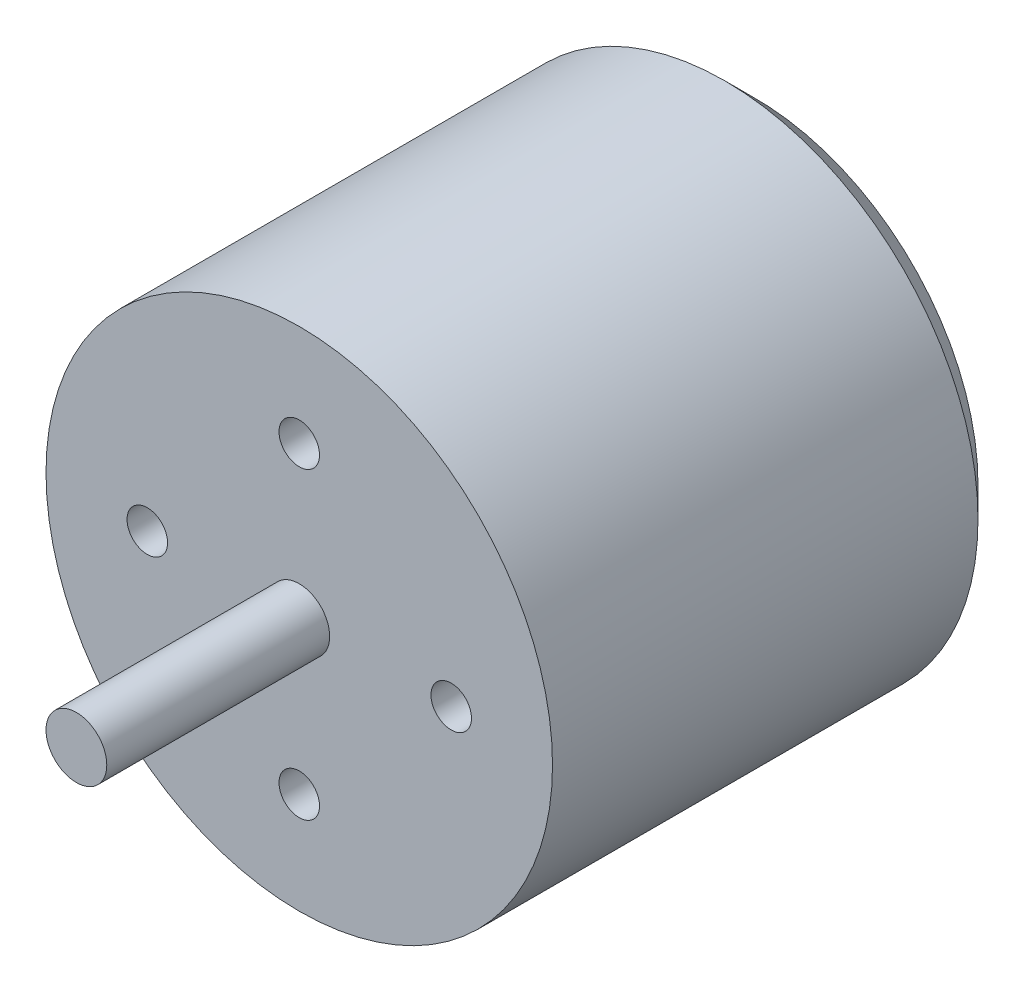
ISO-10303-21;
HEADER;
FILE_DESCRIPTION(('STEP AP214'),'2;1');
FILE_NAME('part.step','',(''),(''),'','','');
FILE_SCHEMA(('AUTOMOTIVE_DESIGN { 1 0 10303 214 1 1 1 1 }'));
ENDSEC;
DATA;
#1=APPLICATION_CONTEXT('core data for automotive mechanical design processes');
#2=APPLICATION_PROTOCOL_DEFINITION('international standard','automotive_design',2000,#1);
#3=PRODUCT_CONTEXT('',#1,'mechanical');
#4=PRODUCT('Part','Part','',(#3));
#5=PRODUCT_RELATED_PRODUCT_CATEGORY('part','',(#4));
#6=PRODUCT_DEFINITION_FORMATION('','',#4);
#7=PRODUCT_DEFINITION_CONTEXT('part definition',#1,'design');
#8=PRODUCT_DEFINITION('design','',#6,#7);
#9=PRODUCT_DEFINITION_SHAPE('','',#8);
#10=(LENGTH_UNIT() NAMED_UNIT(*) SI_UNIT(.MILLI.,.METRE.));
#11=(NAMED_UNIT(*) PLANE_ANGLE_UNIT() SI_UNIT($,.RADIAN.));
#12=(NAMED_UNIT(*) SI_UNIT($,.STERADIAN.) SOLID_ANGLE_UNIT());
#13=UNCERTAINTY_MEASURE_WITH_UNIT(LENGTH_MEASURE(1.E-05),#10,'distance_accuracy_value','');
#14=(GEOMETRIC_REPRESENTATION_CONTEXT(3) GLOBAL_UNCERTAINTY_ASSIGNED_CONTEXT((#13)) GLOBAL_UNIT_ASSIGNED_CONTEXT((#10,
#11,#12)) REPRESENTATION_CONTEXT('',''));
#15=CARTESIAN_POINT('',(0.,0.,0.));
#16=DIRECTION('',(0.,0.,1.));
#17=DIRECTION('',(1.,0.,0.));
#18=AXIS2_PLACEMENT_3D('',#15,#16,#17);
#19=CARTESIAN_POINT('',(0.,0.,45.));
#20=DIRECTION('',(0.,0.,-1.));
#21=DIRECTION('',(-1.,0.,0.));
#22=AXIS2_PLACEMENT_3D('',#19,#20,#21);
#23=CYLINDRICAL_SURFACE('',#22,25.);
#24=CARTESIAN_POINT('',(0.,0.,3.00000000000008));
#25=DIRECTION('',(0.,0.,1.));
#26=DIRECTION('',(1.,0.,0.));
#27=AXIS2_PLACEMENT_3D('',#24,#25,#26);
#28=CIRCLE('',#27,25.);
#29=CARTESIAN_POINT('',(-25.,0.,3.00000000000008));
#30=VERTEX_POINT('',#29);
#31=EDGE_CURVE('E51',#30,#30,#28,.T.);
#32=CARTESIAN_POINT('',(0.,0.,45.));
#33=DIRECTION('',(0.,0.,1.));
#34=DIRECTION('',(1.,0.,0.));
#35=AXIS2_PLACEMENT_3D('',#32,#33,#34);
#36=CIRCLE('',#35,25.);
#37=CARTESIAN_POINT('',(-25.,0.,45.));
#38=VERTEX_POINT('',#37);
#39=EDGE_CURVE('E59',#38,#38,#36,.T.);
#40=CARTESIAN_POINT('',(-25.,0.,3.00000000000008));
#41=CARTESIAN_POINT('',(-25.,0.,3.43750000000008));
#42=CARTESIAN_POINT('',(-25.,0.,3.87500000000008));
#43=CARTESIAN_POINT('',(-25.,0.,4.75000000000007));
#44=CARTESIAN_POINT('',(-25.,0.,5.18750000000007));
#45=CARTESIAN_POINT('',(-25.,0.,6.06250000000007));
#46=CARTESIAN_POINT('',(-25.,0.,6.50000000000008));
#47=CARTESIAN_POINT('',(-25.,0.,7.37500000000007));
#48=CARTESIAN_POINT('',(-25.,0.,7.81250000000007));
#49=CARTESIAN_POINT('',(-25.,0.,8.68750000000007));
#50=CARTESIAN_POINT('',(-25.,0.,9.12500000000007));
#51=CARTESIAN_POINT('',(-25.,0.,10.0000000000001));
#52=CARTESIAN_POINT('',(-25.,0.,10.4375000000001));
#53=CARTESIAN_POINT('',(-25.,0.,11.3125000000001));
#54=CARTESIAN_POINT('',(-25.,0.,11.7500000000001));
#55=CARTESIAN_POINT('',(-25.,0.,12.6250000000001));
#56=CARTESIAN_POINT('',(-25.,0.,13.0625000000001));
#57=CARTESIAN_POINT('',(-25.,0.,13.9375000000001));
#58=CARTESIAN_POINT('',(-25.,0.,14.3750000000001));
#59=CARTESIAN_POINT('',(-25.,0.,15.2500000000001));
#60=CARTESIAN_POINT('',(-25.,0.,15.6875000000001));
#61=CARTESIAN_POINT('',(-25.,0.,16.5625000000001));
#62=CARTESIAN_POINT('',(-25.,0.,17.));
#63=CARTESIAN_POINT('',(-25.,0.,17.875));
#64=CARTESIAN_POINT('',(-25.,0.,18.3125));
#65=CARTESIAN_POINT('',(-25.,0.,19.1875));
#66=CARTESIAN_POINT('',(-25.,0.,19.625));
#67=CARTESIAN_POINT('',(-25.,0.,20.5));
#68=CARTESIAN_POINT('',(-25.,0.,20.9375));
#69=CARTESIAN_POINT('',(-25.,0.,21.8125));
#70=CARTESIAN_POINT('',(-25.,0.,22.25));
#71=CARTESIAN_POINT('',(-25.,0.,23.125));
#72=CARTESIAN_POINT('',(-25.,0.,23.5625));
#73=CARTESIAN_POINT('',(-25.,0.,24.4375));
#74=CARTESIAN_POINT('',(-25.,0.,24.875));
#75=CARTESIAN_POINT('',(-25.,0.,25.75));
#76=CARTESIAN_POINT('',(-25.,0.,26.1875));
#77=CARTESIAN_POINT('',(-25.,0.,27.0625));
#78=CARTESIAN_POINT('',(-25.,0.,27.5));
#79=CARTESIAN_POINT('',(-25.,0.,28.375));
#80=CARTESIAN_POINT('',(-25.,0.,28.8125));
#81=CARTESIAN_POINT('',(-25.,0.,29.6875));
#82=CARTESIAN_POINT('',(-25.,0.,30.125));
#83=CARTESIAN_POINT('',(-25.,0.,31.));
#84=CARTESIAN_POINT('',(-25.,0.,31.4375));
#85=CARTESIAN_POINT('',(-25.,0.,32.3125));
#86=CARTESIAN_POINT('',(-25.,0.,32.75));
#87=CARTESIAN_POINT('',(-25.,0.,33.625));
#88=CARTESIAN_POINT('',(-25.,0.,34.0625));
#89=CARTESIAN_POINT('',(-25.,0.,34.9375));
#90=CARTESIAN_POINT('',(-25.,0.,35.375));
#91=CARTESIAN_POINT('',(-25.,0.,36.25));
#92=CARTESIAN_POINT('',(-25.,0.,36.6875));
#93=CARTESIAN_POINT('',(-25.,0.,37.5625));
#94=CARTESIAN_POINT('',(-25.,0.,38.));
#95=CARTESIAN_POINT('',(-25.,0.,38.875));
#96=CARTESIAN_POINT('',(-25.,0.,39.3125));
#97=CARTESIAN_POINT('',(-25.,0.,40.1875));
#98=CARTESIAN_POINT('',(-25.,0.,40.625));
#99=CARTESIAN_POINT('',(-25.,0.,41.5));
#100=CARTESIAN_POINT('',(-25.,0.,41.9375));
#101=CARTESIAN_POINT('',(-25.,0.,42.8125));
#102=CARTESIAN_POINT('',(-25.,0.,43.25));
#103=CARTESIAN_POINT('',(-25.,0.,44.125));
#104=CARTESIAN_POINT('',(-25.,0.,44.5625));
#105=CARTESIAN_POINT('',(-25.,0.,45.));
#106=B_SPLINE_CURVE_WITH_KNOTS('',3,(#40,#41,#42,#43,#44,#45,#46,#47,#48,#49,#50,#51,#52,#53,
#54,#55,#56,#57,#58,#59,#60,#61,#62,#63,#64,#65,#66,#67,#68,#69,#70,#71,#72,#73,#74,#75,#76,#77,
#78,#79,#80,#81,#82,#83,#84,#85,#86,#87,#88,#89,#90,#91,#92,#93,#94,#95,#96,#97,#98,#99,#100,
#101,#102,#103,#104,#105),.UNSPECIFIED.,.F.,.F.,(4,2,2,2,2,2,2,2,2,2,2,2,2,2,2,2,2,2,2,2,2,2,2,
2,2,2,2,2,2,2,2,2,4),(0.,1.31249999999999,2.625,3.9375,5.24999999999999,6.56249999999998,
7.87499999999999,9.18749999999999,10.5,11.8125,13.125,14.4375,15.75,17.0625,18.375,19.6875,21.,
22.3125,23.625,24.9375,26.25,27.5624999999999,28.8749999999999,30.1874999999999,
31.4999999999999,32.8124999999999,34.1249999999999,35.4374999999999,36.7499999999999,
38.0624999999999,39.3749999999999,40.6874999999999,41.9999999999999),.UNSPECIFIED.);
#107=EDGE_CURVE('BSEAM43',#30,#38,#106,.T.);
#108=ORIENTED_EDGE('',*,*,#31,.T.);
#109=ORIENTED_EDGE('',*,*,#39,.F.);
#110=ORIENTED_EDGE('',*,*,#107,.T.);
#111=ORIENTED_EDGE('',*,*,#107,.F.);
#112=EDGE_LOOP('',(#108,#110,#109,#111));
#113=FACE_BOUND('',#112,.T.);
#114=ADVANCED_FACE('F43',(#113),#23,.T.);
#115=CARTESIAN_POINT('',(0.,0.,45.));
#116=DIRECTION('',(0.,0.,1.));
#117=DIRECTION('',(1.,0.,0.));
#118=AXIS2_PLACEMENT_3D('',#115,#116,#117);
#119=PLANE('',#118);
#120=CARTESIAN_POINT('',(0.,0.,45.));
#121=DIRECTION('',(0.,0.,1.));
#122=DIRECTION('',(1.,0.,0.));
#123=AXIS2_PLACEMENT_3D('',#120,#121,#122);
#124=CIRCLE('',#123,3.);
#125=CARTESIAN_POINT('',(3.,0.,45.));
#126=VERTEX_POINT('',#125);
#127=EDGE_CURVE('E89',#126,#126,#124,.T.);
#128=ORIENTED_EDGE('',*,*,#127,.F.);
#129=EDGE_LOOP('',(#128));
#130=FACE_BOUND('',#129,.T.);
#131=CARTESIAN_POINT('',(0.,15.,45.));
#132=DIRECTION('',(0.,0.,1.));
#133=DIRECTION('',(1.,0.,0.));
#134=AXIS2_PLACEMENT_3D('',#131,#132,#133);
#135=CIRCLE('',#134,2.);
#136=CARTESIAN_POINT('',(2.,15.,45.));
#137=VERTEX_POINT('',#136);
#138=EDGE_CURVE('E84',#137,#137,#135,.T.);
#139=ORIENTED_EDGE('',*,*,#138,.F.);
#140=EDGE_LOOP('',(#139));
#141=FACE_BOUND('',#140,.T.);
#142=CARTESIAN_POINT('',(0.,-15.,45.));
#143=DIRECTION('',(0.,0.,1.));
#144=DIRECTION('',(-1.,0.,0.));
#145=AXIS2_PLACEMENT_3D('',#142,#143,#144);
#146=CIRCLE('',#145,2.);
#147=CARTESIAN_POINT('',(-2.,-15.,45.));
#148=VERTEX_POINT('',#147);
#149=EDGE_CURVE('E78',#148,#148,#146,.T.);
#150=ORIENTED_EDGE('',*,*,#149,.F.);
#151=EDGE_LOOP('',(#150));
#152=FACE_BOUND('',#151,.T.);
#153=CARTESIAN_POINT('',(-15.,0.,45.));
#154=DIRECTION('',(0.,0.,1.));
#155=DIRECTION('',(1.,0.,0.));
#156=AXIS2_PLACEMENT_3D('',#153,#154,#155);
#157=CIRCLE('',#156,2.);
#158=CARTESIAN_POINT('',(-13.,0.,45.));
#159=VERTEX_POINT('',#158);
#160=EDGE_CURVE('E72',#159,#159,#157,.T.);
#161=ORIENTED_EDGE('',*,*,#160,.F.);
#162=EDGE_LOOP('',(#161));
#163=FACE_BOUND('',#162,.T.);
#164=CARTESIAN_POINT('',(15.,0.,45.));
#165=DIRECTION('',(0.,0.,1.));
#166=DIRECTION('',(-1.,0.,0.));
#167=AXIS2_PLACEMENT_3D('',#164,#165,#166);
#168=CIRCLE('',#167,2.);
#169=CARTESIAN_POINT('',(13.,0.,45.));
#170=VERTEX_POINT('',#169);
#171=EDGE_CURVE('E65',#170,#170,#168,.T.);
#172=ORIENTED_EDGE('',*,*,#171,.F.);
#173=EDGE_LOOP('',(#172));
#174=FACE_BOUND('',#173,.T.);
#175=ORIENTED_EDGE('',*,*,#39,.T.);
#176=EDGE_LOOP('',(#175));
#177=FACE_BOUND('',#176,.T.);
#178=ADVANCED_FACE('F135',(#130,#141,#152,#163,#174,#177),#119,.T.);
#179=CARTESIAN_POINT('',(0.,0.,0.));
#180=DIRECTION('',(0.,0.,1.));
#181=DIRECTION('',(1.,0.,0.));
#182=AXIS2_PLACEMENT_3D('',#179,#180,#181);
#183=PLANE('',#182);
#184=CARTESIAN_POINT('',(0.,0.,0.));
#185=DIRECTION('',(0.,0.,1.));
#186=DIRECTION('',(1.,0.,0.));
#187=AXIS2_PLACEMENT_3D('',#184,#185,#186);
#188=CIRCLE('',#187,21.9999999999999);
#189=CARTESIAN_POINT('',(21.9999999999999,0.,0.));
#190=VERTEX_POINT('',#189);
#191=EDGE_CURVE('E10',#190,#190,#188,.F.);
#192=ORIENTED_EDGE('',*,*,#191,.T.);
#193=EDGE_LOOP('',(#192));
#194=FACE_BOUND('',#193,.T.);
#195=CARTESIAN_POINT('',(0.,0.,0.));
#196=DIRECTION('',(0.,0.,1.));
#197=DIRECTION('',(1.,0.,0.));
#198=AXIS2_PLACEMENT_3D('',#195,#196,#197);
#199=CIRCLE('',#198,3.);
#200=CARTESIAN_POINT('',(3.,0.,0.));
#201=VERTEX_POINT('',#200);
#202=EDGE_CURVE('E55',#201,#201,#199,.F.);
#203=ORIENTED_EDGE('',*,*,#202,.F.);
#204=EDGE_LOOP('',(#203));
#205=FACE_BOUND('',#204,.T.);
#206=CARTESIAN_POINT('',(0.,10.,0.));
#207=DIRECTION('',(0.,0.,-1.));
#208=DIRECTION('',(-1.,0.,0.));
#209=AXIS2_PLACEMENT_3D('',#206,#207,#208);
#210=CIRCLE('',#209,1.5);
#211=CARTESIAN_POINT('',(-1.5,10.,0.));
#212=VERTEX_POINT('',#211);
#213=EDGE_CURVE('E114',#212,#212,#210,.T.);
#214=ORIENTED_EDGE('',*,*,#213,.F.);
#215=EDGE_LOOP('',(#214));
#216=FACE_BOUND('',#215,.T.);
#217=CARTESIAN_POINT('',(0.,-10.,0.));
#218=DIRECTION('',(0.,0.,-1.));
#219=DIRECTION('',(1.,0.,0.));
#220=AXIS2_PLACEMENT_3D('',#217,#218,#219);
#221=CIRCLE('',#220,1.5);
#222=CARTESIAN_POINT('',(1.5,-10.,0.));
#223=VERTEX_POINT('',#222);
#224=EDGE_CURVE('E108',#223,#223,#221,.T.);
#225=ORIENTED_EDGE('',*,*,#224,.F.);
#226=EDGE_LOOP('',(#225));
#227=FACE_BOUND('',#226,.T.);
#228=CARTESIAN_POINT('',(10.,0.,0.));
#229=DIRECTION('',(0.,0.,-1.));
#230=DIRECTION('',(-1.,0.,0.));
#231=AXIS2_PLACEMENT_3D('',#228,#229,#230);
#232=CIRCLE('',#231,1.5);
#233=CARTESIAN_POINT('',(8.49999999999999,0.,0.));
#234=VERTEX_POINT('',#233);
#235=EDGE_CURVE('E102',#234,#234,#232,.T.);
#236=ORIENTED_EDGE('',*,*,#235,.F.);
#237=EDGE_LOOP('',(#236));
#238=FACE_BOUND('',#237,.T.);
#239=CARTESIAN_POINT('',(-10.,0.,0.));
#240=DIRECTION('',(0.,0.,-1.));
#241=DIRECTION('',(1.,0.,0.));
#242=AXIS2_PLACEMENT_3D('',#239,#240,#241);
#243=CIRCLE('',#242,1.5);
#244=CARTESIAN_POINT('',(-8.5,0.,0.));
#245=VERTEX_POINT('',#244);
#246=EDGE_CURVE('E95',#245,#245,#243,.T.);
#247=ORIENTED_EDGE('',*,*,#246,.F.);
#248=EDGE_LOOP('',(#247));
#249=FACE_BOUND('',#248,.T.);
#250=ADVANCED_FACE('F131',(#194,#205,#216,#227,#238,#249),#183,.F.);
#251=CARTESIAN_POINT('',(15.,0.,35.));
#252=DIRECTION('',(0.,0.,1.));
#253=DIRECTION('',(1.,0.,0.));
#254=AXIS2_PLACEMENT_3D('',#251,#252,#253);
#255=CYLINDRICAL_SURFACE('',#254,2.);
#256=CARTESIAN_POINT('',(15.,0.,35.));
#257=DIRECTION('',(0.,0.,1.));
#258=DIRECTION('',(-1.,0.,0.));
#259=AXIS2_PLACEMENT_3D('',#256,#257,#258);
#260=CIRCLE('',#259,2.);
#261=CARTESIAN_POINT('',(13.,0.,35.));
#262=VERTEX_POINT('',#261);
#263=EDGE_CURVE('E68',#262,#262,#260,.T.);
#264=ORIENTED_EDGE('',*,*,#263,.F.);
#265=EDGE_LOOP('',(#264));
#266=FACE_BOUND('',#265,.T.);
#267=ORIENTED_EDGE('',*,*,#171,.T.);
#268=EDGE_LOOP('',(#267));
#269=FACE_BOUND('',#268,.T.);
#270=ADVANCED_FACE('F134',(#266,#269),#255,.F.);
#271=CARTESIAN_POINT('',(15.,0.,35.));
#272=DIRECTION('',(0.,0.,-1.));
#273=DIRECTION('',(-1.,0.,0.));
#274=AXIS2_PLACEMENT_3D('',#271,#272,#273);
#275=PLANE('',#274);
#276=ORIENTED_EDGE('',*,*,#263,.T.);
#277=EDGE_LOOP('',(#276));
#278=FACE_BOUND('',#277,.T.);
#279=ADVANCED_FACE('F173',(#278),#275,.F.);
#280=CARTESIAN_POINT('',(-15.,0.,35.));
#281=DIRECTION('',(0.,0.,1.));
#282=DIRECTION('',(1.,0.,0.));
#283=AXIS2_PLACEMENT_3D('',#280,#281,#282);
#284=CYLINDRICAL_SURFACE('',#283,2.);
#285=CARTESIAN_POINT('',(-15.,0.,35.));
#286=DIRECTION('',(0.,0.,1.));
#287=DIRECTION('',(1.,0.,0.));
#288=AXIS2_PLACEMENT_3D('',#285,#286,#287);
#289=CIRCLE('',#288,2.);
#290=CARTESIAN_POINT('',(-13.,0.,35.));
#291=VERTEX_POINT('',#290);
#292=EDGE_CURVE('E75',#291,#291,#289,.T.);
#293=ORIENTED_EDGE('',*,*,#292,.F.);
#294=EDGE_LOOP('',(#293));
#295=FACE_BOUND('',#294,.T.);
#296=ORIENTED_EDGE('',*,*,#160,.T.);
#297=EDGE_LOOP('',(#296));
#298=FACE_BOUND('',#297,.T.);
#299=ADVANCED_FACE('F177',(#295,#298),#284,.F.);
#300=CARTESIAN_POINT('',(-15.,0.,35.));
#301=DIRECTION('',(0.,0.,1.));
#302=DIRECTION('',(1.,0.,0.));
#303=AXIS2_PLACEMENT_3D('',#300,#301,#302);
#304=PLANE('',#303);
#305=ORIENTED_EDGE('',*,*,#292,.T.);
#306=EDGE_LOOP('',(#305));
#307=FACE_BOUND('',#306,.T.);
#308=ADVANCED_FACE('F181',(#307),#304,.T.);
#309=CARTESIAN_POINT('',(0.,-15.,35.));
#310=DIRECTION('',(0.,0.,1.));
#311=DIRECTION('',(1.,0.,0.));
#312=AXIS2_PLACEMENT_3D('',#309,#310,#311);
#313=CYLINDRICAL_SURFACE('',#312,2.);
#314=CARTESIAN_POINT('',(0.,-15.,35.));
#315=DIRECTION('',(0.,0.,1.));
#316=DIRECTION('',(-1.,0.,0.));
#317=AXIS2_PLACEMENT_3D('',#314,#315,#316);
#318=CIRCLE('',#317,2.);
#319=CARTESIAN_POINT('',(-2.,-15.,35.));
#320=VERTEX_POINT('',#319);
#321=EDGE_CURVE('E81',#320,#320,#318,.T.);
#322=ORIENTED_EDGE('',*,*,#321,.F.);
#323=EDGE_LOOP('',(#322));
#324=FACE_BOUND('',#323,.T.);
#325=ORIENTED_EDGE('',*,*,#149,.T.);
#326=EDGE_LOOP('',(#325));
#327=FACE_BOUND('',#326,.T.);
#328=ADVANCED_FACE('F185',(#324,#327),#313,.F.);
#329=CARTESIAN_POINT('',(0.,-15.,35.));
#330=DIRECTION('',(0.,0.,-1.));
#331=DIRECTION('',(-1.,0.,0.));
#332=AXIS2_PLACEMENT_3D('',#329,#330,#331);
#333=PLANE('',#332);
#334=ORIENTED_EDGE('',*,*,#321,.T.);
#335=EDGE_LOOP('',(#334));
#336=FACE_BOUND('',#335,.T.);
#337=ADVANCED_FACE('F189',(#336),#333,.F.);
#338=CARTESIAN_POINT('',(0.,15.,35.));
#339=DIRECTION('',(0.,0.,1.));
#340=DIRECTION('',(1.,0.,0.));
#341=AXIS2_PLACEMENT_3D('',#338,#339,#340);
#342=CYLINDRICAL_SURFACE('',#341,2.);
#343=CARTESIAN_POINT('',(0.,15.,35.));
#344=DIRECTION('',(0.,0.,1.));
#345=DIRECTION('',(1.,0.,0.));
#346=AXIS2_PLACEMENT_3D('',#343,#344,#345);
#347=CIRCLE('',#346,2.);
#348=CARTESIAN_POINT('',(2.,15.,35.));
#349=VERTEX_POINT('',#348);
#350=EDGE_CURVE('E64',#349,#349,#347,.T.);
#351=ORIENTED_EDGE('',*,*,#350,.F.);
#352=EDGE_LOOP('',(#351));
#353=FACE_BOUND('',#352,.T.);
#354=ORIENTED_EDGE('',*,*,#138,.T.);
#355=EDGE_LOOP('',(#354));
#356=FACE_BOUND('',#355,.T.);
#357=ADVANCED_FACE('F193',(#353,#356),#342,.F.);
#358=CARTESIAN_POINT('',(0.,15.,35.));
#359=DIRECTION('',(0.,0.,1.));
#360=DIRECTION('',(1.,0.,0.));
#361=AXIS2_PLACEMENT_3D('',#358,#359,#360);
#362=PLANE('',#361);
#363=ORIENTED_EDGE('',*,*,#350,.T.);
#364=EDGE_LOOP('',(#363));
#365=FACE_BOUND('',#364,.T.);
#366=ADVANCED_FACE('F197',(#365),#362,.T.);
#367=CARTESIAN_POINT('',(0.,0.,67.));
#368=DIRECTION('',(0.,0.,-1.));
#369=DIRECTION('',(-1.,0.,0.));
#370=AXIS2_PLACEMENT_3D('',#367,#368,#369);
#371=CYLINDRICAL_SURFACE('',#370,3.);
#372=CARTESIAN_POINT('',(0.,0.,67.));
#373=DIRECTION('',(0.,0.,1.));
#374=DIRECTION('',(1.,0.,0.));
#375=AXIS2_PLACEMENT_3D('',#372,#373,#374);
#376=CIRCLE('',#375,3.);
#377=CARTESIAN_POINT('',(3.,0.,67.));
#378=VERTEX_POINT('',#377);
#379=EDGE_CURVE('E69',#378,#378,#376,.T.);
#380=ORIENTED_EDGE('',*,*,#379,.F.);
#381=EDGE_LOOP('',(#380));
#382=FACE_BOUND('',#381,.T.);
#383=ORIENTED_EDGE('',*,*,#127,.T.);
#384=EDGE_LOOP('',(#383));
#385=FACE_BOUND('',#384,.T.);
#386=ADVANCED_FACE('F158',(#382,#385),#371,.T.);
#387=CARTESIAN_POINT('',(0.,0.,67.));
#388=DIRECTION('',(0.,0.,1.));
#389=DIRECTION('',(1.,0.,0.));
#390=AXIS2_PLACEMENT_3D('',#387,#388,#389);
#391=PLANE('',#390);
#392=ORIENTED_EDGE('',*,*,#379,.T.);
#393=EDGE_LOOP('',(#392));
#394=FACE_BOUND('',#393,.T.);
#395=ADVANCED_FACE('F148',(#394),#391,.T.);
#396=CARTESIAN_POINT('',(-10.,0.,10.));
#397=DIRECTION('',(0.,0.,-1.));
#398=DIRECTION('',(-1.,0.,0.));
#399=AXIS2_PLACEMENT_3D('',#396,#397,#398);
#400=CYLINDRICAL_SURFACE('',#399,1.5);
#401=CARTESIAN_POINT('',(-10.,0.,10.));
#402=DIRECTION('',(0.,0.,-1.));
#403=DIRECTION('',(1.,0.,0.));
#404=AXIS2_PLACEMENT_3D('',#401,#402,#403);
#405=CIRCLE('',#404,1.5);
#406=CARTESIAN_POINT('',(-8.5,0.,10.));
#407=VERTEX_POINT('',#406);
#408=EDGE_CURVE('E98',#407,#407,#405,.T.);
#409=ORIENTED_EDGE('',*,*,#408,.F.);
#410=EDGE_LOOP('',(#409));
#411=FACE_BOUND('',#410,.T.);
#412=ORIENTED_EDGE('',*,*,#246,.T.);
#413=EDGE_LOOP('',(#412));
#414=FACE_BOUND('',#413,.T.);
#415=ADVANCED_FACE('F145',(#411,#414),#400,.F.);
#416=CARTESIAN_POINT('',(-10.,0.,10.));
#417=DIRECTION('',(0.,0.,1.));
#418=DIRECTION('',(1.,0.,0.));
#419=AXIS2_PLACEMENT_3D('',#416,#417,#418);
#420=PLANE('',#419);
#421=ORIENTED_EDGE('',*,*,#408,.T.);
#422=EDGE_LOOP('',(#421));
#423=FACE_BOUND('',#422,.T.);
#424=ADVANCED_FACE('F147',(#423),#420,.F.);
#425=CARTESIAN_POINT('',(10.,0.,10.));
#426=DIRECTION('',(0.,0.,-1.));
#427=DIRECTION('',(-1.,0.,0.));
#428=AXIS2_PLACEMENT_3D('',#425,#426,#427);
#429=CYLINDRICAL_SURFACE('',#428,1.5);
#430=CARTESIAN_POINT('',(10.,0.,10.));
#431=DIRECTION('',(0.,0.,-1.));
#432=DIRECTION('',(-1.,0.,0.));
#433=AXIS2_PLACEMENT_3D('',#430,#431,#432);
#434=CIRCLE('',#433,1.5);
#435=CARTESIAN_POINT('',(8.49999999999999,0.,10.));
#436=VERTEX_POINT('',#435);
#437=EDGE_CURVE('E105',#436,#436,#434,.T.);
#438=ORIENTED_EDGE('',*,*,#437,.F.);
#439=EDGE_LOOP('',(#438));
#440=FACE_BOUND('',#439,.T.);
#441=ORIENTED_EDGE('',*,*,#235,.T.);
#442=EDGE_LOOP('',(#441));
#443=FACE_BOUND('',#442,.T.);
#444=ADVANCED_FACE('F155',(#440,#443),#429,.F.);
#445=CARTESIAN_POINT('',(10.,0.,10.));
#446=DIRECTION('',(0.,0.,-1.));
#447=DIRECTION('',(-1.,0.,0.));
#448=AXIS2_PLACEMENT_3D('',#445,#446,#447);
#449=PLANE('',#448);
#450=ORIENTED_EDGE('',*,*,#437,.T.);
#451=EDGE_LOOP('',(#450));
#452=FACE_BOUND('',#451,.T.);
#453=ADVANCED_FACE('F251',(#452),#449,.T.);
#454=CARTESIAN_POINT('',(0.,-10.,10.));
#455=DIRECTION('',(0.,0.,-1.));
#456=DIRECTION('',(-1.,0.,0.));
#457=AXIS2_PLACEMENT_3D('',#454,#455,#456);
#458=CYLINDRICAL_SURFACE('',#457,1.5);
#459=CARTESIAN_POINT('',(0.,-10.,10.));
#460=DIRECTION('',(0.,0.,-1.));
#461=DIRECTION('',(1.,0.,0.));
#462=AXIS2_PLACEMENT_3D('',#459,#460,#461);
#463=CIRCLE('',#462,1.5);
#464=CARTESIAN_POINT('',(1.5,-10.,10.));
#465=VERTEX_POINT('',#464);
#466=EDGE_CURVE('E111',#465,#465,#463,.T.);
#467=ORIENTED_EDGE('',*,*,#466,.F.);
#468=EDGE_LOOP('',(#467));
#469=FACE_BOUND('',#468,.T.);
#470=ORIENTED_EDGE('',*,*,#224,.T.);
#471=EDGE_LOOP('',(#470));
#472=FACE_BOUND('',#471,.T.);
#473=ADVANCED_FACE('F261',(#469,#472),#458,.F.);
#474=CARTESIAN_POINT('',(0.,-10.,10.));
#475=DIRECTION('',(0.,0.,1.));
#476=DIRECTION('',(1.,0.,0.));
#477=AXIS2_PLACEMENT_3D('',#474,#475,#476);
#478=PLANE('',#477);
#479=ORIENTED_EDGE('',*,*,#466,.T.);
#480=EDGE_LOOP('',(#479));
#481=FACE_BOUND('',#480,.T.);
#482=ADVANCED_FACE('F271',(#481),#478,.F.);
#483=CARTESIAN_POINT('',(0.,10.,10.));
#484=DIRECTION('',(0.,0.,-1.));
#485=DIRECTION('',(-1.,0.,0.));
#486=AXIS2_PLACEMENT_3D('',#483,#484,#485);
#487=CYLINDRICAL_SURFACE('',#486,1.5);
#488=CARTESIAN_POINT('',(0.,10.,10.));
#489=DIRECTION('',(0.,0.,-1.));
#490=DIRECTION('',(-1.,0.,0.));
#491=AXIS2_PLACEMENT_3D('',#488,#489,#490);
#492=CIRCLE('',#491,1.5);
#493=CARTESIAN_POINT('',(-1.5,10.,10.));
#494=VERTEX_POINT('',#493);
#495=EDGE_CURVE('E92',#494,#494,#492,.T.);
#496=ORIENTED_EDGE('',*,*,#495,.F.);
#497=EDGE_LOOP('',(#496));
#498=FACE_BOUND('',#497,.T.);
#499=ORIENTED_EDGE('',*,*,#213,.T.);
#500=EDGE_LOOP('',(#499));
#501=FACE_BOUND('',#500,.T.);
#502=ADVANCED_FACE('F281',(#498,#501),#487,.F.);
#503=CARTESIAN_POINT('',(0.,10.,10.));
#504=DIRECTION('',(0.,0.,-1.));
#505=DIRECTION('',(-1.,0.,0.));
#506=AXIS2_PLACEMENT_3D('',#503,#504,#505);
#507=PLANE('',#506);
#508=ORIENTED_EDGE('',*,*,#495,.T.);
#509=EDGE_LOOP('',(#508));
#510=FACE_BOUND('',#509,.T.);
#511=ADVANCED_FACE('F127',(#510),#507,.T.);
#512=CARTESIAN_POINT('',(0.,0.,-2.));
#513=DIRECTION('',(0.,0.,1.));
#514=DIRECTION('',(1.,0.,0.));
#515=AXIS2_PLACEMENT_3D('',#512,#513,#514);
#516=CYLINDRICAL_SURFACE('',#515,3.);
#517=CARTESIAN_POINT('',(0.,0.,-2.));
#518=DIRECTION('',(0.,0.,-1.));
#519=DIRECTION('',(-1.,0.,0.));
#520=AXIS2_PLACEMENT_3D('',#517,#518,#519);
#521=CIRCLE('',#520,3.);
#522=CARTESIAN_POINT('',(-3.,0.,-2.));
#523=VERTEX_POINT('',#522);
#524=EDGE_CURVE('E99',#523,#523,#521,.T.);
#525=ORIENTED_EDGE('',*,*,#524,.F.);
#526=EDGE_LOOP('',(#525));
#527=FACE_BOUND('',#526,.T.);
#528=ORIENTED_EDGE('',*,*,#202,.T.);
#529=EDGE_LOOP('',(#528));
#530=FACE_BOUND('',#529,.T.);
#531=ADVANCED_FACE('F124',(#527,#530),#516,.T.);
#532=CARTESIAN_POINT('',(0.,0.,-2.));
#533=DIRECTION('',(0.,0.,-1.));
#534=DIRECTION('',(-1.,0.,0.));
#535=AXIS2_PLACEMENT_3D('',#532,#533,#534);
#536=PLANE('',#535);
#537=ORIENTED_EDGE('',*,*,#524,.T.);
#538=EDGE_LOOP('',(#537));
#539=FACE_BOUND('',#538,.T.);
#540=ADVANCED_FACE('F122',(#539),#536,.T.);
#541=CARTESIAN_POINT('',(0.,0.,3.00000000000007));
#542=DIRECTION('',(0.,0.,1.));
#543=DIRECTION('',(1.,0.,0.));
#544=AXIS2_PLACEMENT_3D('',#541,#542,#543);
#545=CONICAL_SURFACE('',#544,25.,0.785398163397447);
#546=ORIENTED_EDGE('',*,*,#191,.F.);
#547=EDGE_LOOP('',(#546));
#548=FACE_BOUND('',#547,.T.);
#549=ORIENTED_EDGE('',*,*,#31,.F.);
#550=EDGE_LOOP('',(#549));
#551=FACE_BOUND('',#550,.T.);
#552=ADVANCED_FACE('F46',(#548,#551),#545,.T.);
#553=CLOSED_SHELL('',(#114,#178,#250,#270,#279,#299,#308,#328,#337,#357,#366,#386,#395,#415,
#424,#444,#453,#473,#482,#502,#511,#531,#540,#552));
#554=MANIFOLD_SOLID_BREP('B2',#553);
#555=ADVANCED_BREP_SHAPE_REPRESENTATION('',(#18,#554),#14);
#556=SHAPE_DEFINITION_REPRESENTATION(#9,#555);
ENDSEC;
END-ISO-10303-21;
